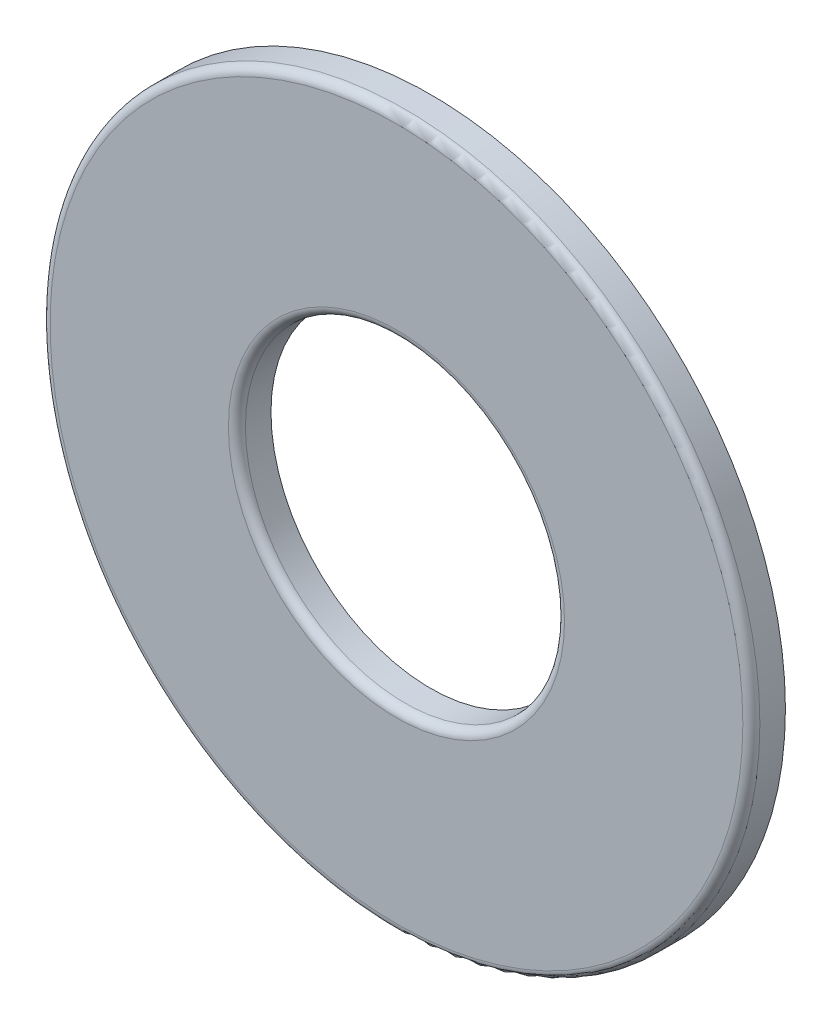
ISO-10303-21;
HEADER;
FILE_DESCRIPTION(('STEP AP214'),'2;1');
FILE_NAME('part.step','',(''),(''),'','','');
FILE_SCHEMA(('AUTOMOTIVE_DESIGN { 1 0 10303 214 1 1 1 1 }'));
ENDSEC;
DATA;
#1=APPLICATION_CONTEXT('core data for automotive mechanical design processes');
#2=APPLICATION_PROTOCOL_DEFINITION('international standard','automotive_design',2000,#1);
#3=PRODUCT_CONTEXT('',#1,'mechanical');
#4=PRODUCT('Part','Part','',(#3));
#5=PRODUCT_RELATED_PRODUCT_CATEGORY('part','',(#4));
#6=PRODUCT_DEFINITION_FORMATION('','',#4);
#7=PRODUCT_DEFINITION_CONTEXT('part definition',#1,'design');
#8=PRODUCT_DEFINITION('design','',#6,#7);
#9=PRODUCT_DEFINITION_SHAPE('','',#8);
#10=(LENGTH_UNIT() NAMED_UNIT(*) SI_UNIT(.MILLI.,.METRE.));
#11=(NAMED_UNIT(*) PLANE_ANGLE_UNIT() SI_UNIT($,.RADIAN.));
#12=(NAMED_UNIT(*) SI_UNIT($,.STERADIAN.) SOLID_ANGLE_UNIT());
#13=UNCERTAINTY_MEASURE_WITH_UNIT(LENGTH_MEASURE(1.E-05),#10,'distance_accuracy_value','');
#14=(GEOMETRIC_REPRESENTATION_CONTEXT(3) GLOBAL_UNCERTAINTY_ASSIGNED_CONTEXT((#13)) GLOBAL_UNIT_ASSIGNED_CONTEXT((#10,
#11,#12)) REPRESENTATION_CONTEXT('',''));
#15=CARTESIAN_POINT('',(0.,0.,0.));
#16=DIRECTION('',(0.,0.,1.));
#17=DIRECTION('',(1.,0.,0.));
#18=AXIS2_PLACEMENT_3D('',#15,#16,#17);
#19=CARTESIAN_POINT('',(0.,0.,0.381));
#20=DIRECTION('',(0.,0.,1.));
#21=DIRECTION('',(1.,0.,0.));
#22=AXIS2_PLACEMENT_3D('',#19,#20,#21);
#23=PLANE('',#22);
#24=CARTESIAN_POINT('',(0.,0.,0.381));
#25=DIRECTION('',(0.,0.,1.));
#26=DIRECTION('',(1.,0.,0.));
#27=AXIS2_PLACEMENT_3D('',#24,#25,#26);
#28=CIRCLE('',#27,7.747);
#29=CARTESIAN_POINT('',(7.747,0.,0.381));
#30=VERTEX_POINT('',#29);
#31=EDGE_CURVE('E53',#30,#30,#28,.T.);
#32=ORIENTED_EDGE('',*,*,#31,.T.);
#33=EDGE_LOOP('',(#32));
#34=FACE_BOUND('',#33,.T.);
#35=CARTESIAN_POINT('',(0.,0.,0.381));
#36=DIRECTION('',(0.,0.,1.));
#37=DIRECTION('',(1.,0.,0.));
#38=AXIS2_PLACEMENT_3D('',#35,#36,#37);
#39=CIRCLE('',#38,3.7592);
#40=CARTESIAN_POINT('',(3.7592,0.,0.381));
#41=VERTEX_POINT('',#40);
#42=EDGE_CURVE('E57',#41,#41,#39,.F.);
#43=ORIENTED_EDGE('',*,*,#42,.T.);
#44=EDGE_LOOP('',(#43));
#45=FACE_BOUND('',#44,.T.);
#46=ADVANCED_FACE('F42',(#34,#45),#23,.T.);
#47=CARTESIAN_POINT('',(0.,0.,0.381));
#48=DIRECTION('',(0.,0.,-1.));
#49=DIRECTION('',(-1.,0.,0.));
#50=AXIS2_PLACEMENT_3D('',#47,#48,#49);
#51=CYLINDRICAL_SURFACE('',#50,7.9375);
#52=CARTESIAN_POINT('',(0.,0.,0.1905));
#53=DIRECTION('',(0.,0.,1.));
#54=DIRECTION('',(1.,0.,0.));
#55=AXIS2_PLACEMENT_3D('',#52,#53,#54);
#56=CIRCLE('',#55,7.9375);
#57=CARTESIAN_POINT('',(-7.9375,0.,0.1905));
#58=VERTEX_POINT('',#57);
#59=EDGE_CURVE('E49',#58,#58,#56,.F.);
#60=CARTESIAN_POINT('',(0.,0.,-0.381));
#61=DIRECTION('',(0.,0.,1.));
#62=DIRECTION('',(1.,0.,0.));
#63=AXIS2_PLACEMENT_3D('',#60,#61,#62);
#64=CIRCLE('',#63,7.9375);
#65=CARTESIAN_POINT('',(-7.9375,0.,-0.381));
#66=VERTEX_POINT('',#65);
#67=EDGE_CURVE('E62',#66,#66,#64,.T.);
#68=CARTESIAN_POINT('',(-7.9375,0.,0.1905));
#69=CARTESIAN_POINT('',(-7.9375,0.,0.184546875));
#70=CARTESIAN_POINT('',(-7.9375,0.,0.17859375));
#71=CARTESIAN_POINT('',(-7.9375,0.,0.1666875));
#72=CARTESIAN_POINT('',(-7.9375,0.,0.160734375));
#73=CARTESIAN_POINT('',(-7.9375,0.,0.148828125));
#74=CARTESIAN_POINT('',(-7.9375,0.,0.142875));
#75=CARTESIAN_POINT('',(-7.9375,0.,0.13096875));
#76=CARTESIAN_POINT('',(-7.9375,0.,0.125015625));
#77=CARTESIAN_POINT('',(-7.9375,0.,0.113109375));
#78=CARTESIAN_POINT('',(-7.9375,0.,0.10715625));
#79=CARTESIAN_POINT('',(-7.9375,0.,0.09525));
#80=CARTESIAN_POINT('',(-7.9375,0.,0.089296875));
#81=CARTESIAN_POINT('',(-7.9375,0.,0.077390625));
#82=CARTESIAN_POINT('',(-7.9375,0.,0.0714375));
#83=CARTESIAN_POINT('',(-7.9375,0.,0.05953125));
#84=CARTESIAN_POINT('',(-7.9375,0.,0.053578125));
#85=CARTESIAN_POINT('',(-7.9375,0.,0.041671875));
#86=CARTESIAN_POINT('',(-7.9375,0.,0.03571875));
#87=CARTESIAN_POINT('',(-7.9375,0.,0.0238125));
#88=CARTESIAN_POINT('',(-7.9375,0.,0.017859375));
#89=CARTESIAN_POINT('',(-7.9375,0.,0.00595312499999999));
#90=CARTESIAN_POINT('',(-7.9375,0.,0.));
#91=CARTESIAN_POINT('',(-7.9375,0.,-0.01190625));
#92=CARTESIAN_POINT('',(-7.9375,0.,-0.017859375));
#93=CARTESIAN_POINT('',(-7.9375,0.,-0.029765625));
#94=CARTESIAN_POINT('',(-7.9375,0.,-0.03571875));
#95=CARTESIAN_POINT('',(-7.9375,0.,-0.047625));
#96=CARTESIAN_POINT('',(-7.9375,0.,-0.053578125));
#97=CARTESIAN_POINT('',(-7.9375,0.,-0.065484375));
#98=CARTESIAN_POINT('',(-7.9375,0.,-0.0714375));
#99=CARTESIAN_POINT('',(-7.9375,0.,-0.08334375));
#100=CARTESIAN_POINT('',(-7.9375,0.,-0.089296875));
#101=CARTESIAN_POINT('',(-7.9375,0.,-0.101203125));
#102=CARTESIAN_POINT('',(-7.9375,0.,-0.10715625));
#103=CARTESIAN_POINT('',(-7.9375,0.,-0.1190625));
#104=CARTESIAN_POINT('',(-7.9375,0.,-0.125015625));
#105=CARTESIAN_POINT('',(-7.9375,0.,-0.136921875));
#106=CARTESIAN_POINT('',(-7.9375,0.,-0.142875));
#107=CARTESIAN_POINT('',(-7.9375,0.,-0.15478125));
#108=CARTESIAN_POINT('',(-7.9375,0.,-0.160734375));
#109=CARTESIAN_POINT('',(-7.9375,0.,-0.172640625));
#110=CARTESIAN_POINT('',(-7.9375,0.,-0.17859375));
#111=CARTESIAN_POINT('',(-7.9375,0.,-0.1905));
#112=CARTESIAN_POINT('',(-7.9375,0.,-0.196453125));
#113=CARTESIAN_POINT('',(-7.9375,0.,-0.208359375));
#114=CARTESIAN_POINT('',(-7.9375,0.,-0.2143125));
#115=CARTESIAN_POINT('',(-7.9375,0.,-0.22621875));
#116=CARTESIAN_POINT('',(-7.9375,0.,-0.232171875));
#117=CARTESIAN_POINT('',(-7.9375,0.,-0.244078125));
#118=CARTESIAN_POINT('',(-7.9375,0.,-0.25003125));
#119=CARTESIAN_POINT('',(-7.9375,0.,-0.2619375));
#120=CARTESIAN_POINT('',(-7.9375,0.,-0.267890625));
#121=CARTESIAN_POINT('',(-7.9375,0.,-0.279796875));
#122=CARTESIAN_POINT('',(-7.9375,0.,-0.28575));
#123=CARTESIAN_POINT('',(-7.9375,0.,-0.29765625));
#124=CARTESIAN_POINT('',(-7.9375,0.,-0.303609375));
#125=CARTESIAN_POINT('',(-7.9375,0.,-0.315515625));
#126=CARTESIAN_POINT('',(-7.9375,0.,-0.32146875));
#127=CARTESIAN_POINT('',(-7.9375,0.,-0.333375));
#128=CARTESIAN_POINT('',(-7.9375,0.,-0.339328125));
#129=CARTESIAN_POINT('',(-7.9375,0.,-0.351234375));
#130=CARTESIAN_POINT('',(-7.9375,0.,-0.3571875));
#131=CARTESIAN_POINT('',(-7.9375,0.,-0.36909375));
#132=CARTESIAN_POINT('',(-7.9375,0.,-0.375046875));
#133=CARTESIAN_POINT('',(-7.9375,0.,-0.381));
#134=B_SPLINE_CURVE_WITH_KNOTS('',3,(#68,#69,#70,#71,#72,#73,#74,#75,#76,#77,#78,#79,#80,#81,
#82,#83,#84,#85,#86,#87,#88,#89,#90,#91,#92,#93,#94,#95,#96,#97,#98,#99,#100,#101,#102,#103,
#104,#105,#106,#107,#108,#109,#110,#111,#112,#113,#114,#115,#116,#117,#118,#119,#120,#121,#122,
#123,#124,#125,#126,#127,#128,#129,#130,#131,#132,#133),.UNSPECIFIED.,.F.,.F.,(4,2,2,2,2,2,2,2,
2,2,2,2,2,2,2,2,2,2,2,2,2,2,2,2,2,2,2,2,2,2,2,2,4),(0.,0.017859375,0.03571875,0.053578125,
0.0714375,0.089296875,0.10715625,0.125015625,0.142875,0.160734375,0.17859375,0.196453125,
0.2143125,0.232171875,0.25003125,0.267890625,0.28575,0.303609375,0.32146875,0.339328125,
0.3571875,0.375046875,0.39290625,0.410765625,0.428625,0.446484375,0.46434375,0.482203125,
0.5000625,0.517921875,0.53578125,0.553640625,0.5715),.UNSPECIFIED.);
#135=EDGE_CURVE('BSEAM74',#58,#66,#134,.T.);
#136=ORIENTED_EDGE('',*,*,#59,.T.);
#137=ORIENTED_EDGE('',*,*,#67,.T.);
#138=ORIENTED_EDGE('',*,*,#135,.T.);
#139=ORIENTED_EDGE('',*,*,#135,.F.);
#140=EDGE_LOOP('',(#136,#138,#137,#139));
#141=FACE_BOUND('',#140,.T.);
#142=ADVANCED_FACE('F74',(#141),#51,.T.);
#143=CARTESIAN_POINT('',(0.,0.,0.381));
#144=DIRECTION('',(0.,0.,-1.));
#145=DIRECTION('',(-1.,0.,0.));
#146=AXIS2_PLACEMENT_3D('',#143,#144,#145);
#147=CYLINDRICAL_SURFACE('',#146,3.5687);
#148=CARTESIAN_POINT('',(0.,0.,0.1905));
#149=DIRECTION('',(0.,0.,1.));
#150=DIRECTION('',(1.,0.,0.));
#151=AXIS2_PLACEMENT_3D('',#148,#149,#150);
#152=CIRCLE('',#151,3.5687);
#153=CARTESIAN_POINT('',(-3.5687,0.,0.1905));
#154=VERTEX_POINT('',#153);
#155=EDGE_CURVE('E10',#154,#154,#152,.T.);
#156=CARTESIAN_POINT('',(0.,0.,-0.381));
#157=DIRECTION('',(0.,0.,1.));
#158=DIRECTION('',(1.,0.,0.));
#159=AXIS2_PLACEMENT_3D('',#156,#157,#158);
#160=CIRCLE('',#159,3.5687);
#161=CARTESIAN_POINT('',(-3.5687,0.,-0.381));
#162=VERTEX_POINT('',#161);
#163=EDGE_CURVE('E65',#162,#162,#160,.T.);
#164=CARTESIAN_POINT('',(-3.5687,0.,0.1905));
#165=CARTESIAN_POINT('',(-3.5687,0.,0.184546875));
#166=CARTESIAN_POINT('',(-3.5687,0.,0.17859375));
#167=CARTESIAN_POINT('',(-3.5687,0.,0.1666875));
#168=CARTESIAN_POINT('',(-3.5687,0.,0.160734375));
#169=CARTESIAN_POINT('',(-3.5687,0.,0.148828125));
#170=CARTESIAN_POINT('',(-3.5687,0.,0.142875));
#171=CARTESIAN_POINT('',(-3.5687,0.,0.13096875));
#172=CARTESIAN_POINT('',(-3.5687,0.,0.125015625));
#173=CARTESIAN_POINT('',(-3.5687,0.,0.113109375));
#174=CARTESIAN_POINT('',(-3.5687,0.,0.10715625));
#175=CARTESIAN_POINT('',(-3.5687,0.,0.09525));
#176=CARTESIAN_POINT('',(-3.5687,0.,0.089296875));
#177=CARTESIAN_POINT('',(-3.5687,0.,0.077390625));
#178=CARTESIAN_POINT('',(-3.5687,0.,0.0714375));
#179=CARTESIAN_POINT('',(-3.5687,0.,0.05953125));
#180=CARTESIAN_POINT('',(-3.5687,0.,0.053578125));
#181=CARTESIAN_POINT('',(-3.5687,0.,0.041671875));
#182=CARTESIAN_POINT('',(-3.5687,0.,0.03571875));
#183=CARTESIAN_POINT('',(-3.5687,0.,0.0238125));
#184=CARTESIAN_POINT('',(-3.5687,0.,0.017859375));
#185=CARTESIAN_POINT('',(-3.5687,0.,0.00595312499999999));
#186=CARTESIAN_POINT('',(-3.5687,0.,0.));
#187=CARTESIAN_POINT('',(-3.5687,0.,-0.01190625));
#188=CARTESIAN_POINT('',(-3.5687,0.,-0.017859375));
#189=CARTESIAN_POINT('',(-3.5687,0.,-0.029765625));
#190=CARTESIAN_POINT('',(-3.5687,0.,-0.03571875));
#191=CARTESIAN_POINT('',(-3.5687,0.,-0.047625));
#192=CARTESIAN_POINT('',(-3.5687,0.,-0.053578125));
#193=CARTESIAN_POINT('',(-3.5687,0.,-0.065484375));
#194=CARTESIAN_POINT('',(-3.5687,0.,-0.0714375));
#195=CARTESIAN_POINT('',(-3.5687,0.,-0.08334375));
#196=CARTESIAN_POINT('',(-3.5687,0.,-0.089296875));
#197=CARTESIAN_POINT('',(-3.5687,0.,-0.101203125));
#198=CARTESIAN_POINT('',(-3.5687,0.,-0.10715625));
#199=CARTESIAN_POINT('',(-3.5687,0.,-0.1190625));
#200=CARTESIAN_POINT('',(-3.5687,0.,-0.125015625));
#201=CARTESIAN_POINT('',(-3.5687,0.,-0.136921875));
#202=CARTESIAN_POINT('',(-3.5687,0.,-0.142875));
#203=CARTESIAN_POINT('',(-3.5687,0.,-0.15478125));
#204=CARTESIAN_POINT('',(-3.5687,0.,-0.160734375));
#205=CARTESIAN_POINT('',(-3.5687,0.,-0.172640625));
#206=CARTESIAN_POINT('',(-3.5687,0.,-0.17859375));
#207=CARTESIAN_POINT('',(-3.5687,0.,-0.1905));
#208=CARTESIAN_POINT('',(-3.5687,0.,-0.196453125));
#209=CARTESIAN_POINT('',(-3.5687,0.,-0.208359375));
#210=CARTESIAN_POINT('',(-3.5687,0.,-0.2143125));
#211=CARTESIAN_POINT('',(-3.5687,0.,-0.22621875));
#212=CARTESIAN_POINT('',(-3.5687,0.,-0.232171875));
#213=CARTESIAN_POINT('',(-3.5687,0.,-0.244078125));
#214=CARTESIAN_POINT('',(-3.5687,0.,-0.25003125));
#215=CARTESIAN_POINT('',(-3.5687,0.,-0.2619375));
#216=CARTESIAN_POINT('',(-3.5687,0.,-0.267890625));
#217=CARTESIAN_POINT('',(-3.5687,0.,-0.279796875));
#218=CARTESIAN_POINT('',(-3.5687,0.,-0.28575));
#219=CARTESIAN_POINT('',(-3.5687,0.,-0.29765625));
#220=CARTESIAN_POINT('',(-3.5687,0.,-0.303609375));
#221=CARTESIAN_POINT('',(-3.5687,0.,-0.315515625));
#222=CARTESIAN_POINT('',(-3.5687,0.,-0.32146875));
#223=CARTESIAN_POINT('',(-3.5687,0.,-0.333375));
#224=CARTESIAN_POINT('',(-3.5687,0.,-0.339328125));
#225=CARTESIAN_POINT('',(-3.5687,0.,-0.351234375));
#226=CARTESIAN_POINT('',(-3.5687,0.,-0.3571875));
#227=CARTESIAN_POINT('',(-3.5687,0.,-0.36909375));
#228=CARTESIAN_POINT('',(-3.5687,0.,-0.375046875));
#229=CARTESIAN_POINT('',(-3.5687,0.,-0.381));
#230=B_SPLINE_CURVE_WITH_KNOTS('',3,(#164,#165,#166,#167,#168,#169,#170,#171,#172,#173,#174,
#175,#176,#177,#178,#179,#180,#181,#182,#183,#184,#185,#186,#187,#188,#189,#190,#191,#192,#193,
#194,#195,#196,#197,#198,#199,#200,#201,#202,#203,#204,#205,#206,#207,#208,#209,#210,#211,#212,
#213,#214,#215,#216,#217,#218,#219,#220,#221,#222,#223,#224,#225,#226,#227,#228,#229),
.UNSPECIFIED.,.F.,.F.,(4,2,2,2,2,2,2,2,2,2,2,2,2,2,2,2,2,2,2,2,2,2,2,2,2,2,2,2,2,2,2,2,4),(0.,
0.017859375,0.03571875,0.053578125,0.0714375,0.089296875,0.10715625,0.125015625,0.142875,
0.160734375,0.17859375,0.196453125,0.2143125,0.232171875,0.25003125,0.267890625,0.28575,
0.303609375,0.32146875,0.339328125,0.3571875,0.375046875,0.39290625,0.410765625,0.428625,
0.446484375,0.46434375,0.482203125,0.5000625,0.517921875,0.53578125,0.553640625,0.5715),.UNSPECIFIED.);
#231=EDGE_CURVE('BSEAM72',#154,#162,#230,.T.);
#232=ORIENTED_EDGE('',*,*,#155,.T.);
#233=ORIENTED_EDGE('',*,*,#163,.F.);
#234=ORIENTED_EDGE('',*,*,#231,.T.);
#235=ORIENTED_EDGE('',*,*,#231,.F.);
#236=EDGE_LOOP('',(#232,#234,#233,#235));
#237=FACE_BOUND('',#236,.T.);
#238=ADVANCED_FACE('F72',(#237),#147,.F.);
#239=CARTESIAN_POINT('',(0.,0.,-0.381));
#240=DIRECTION('',(0.,0.,1.));
#241=DIRECTION('',(1.,0.,0.));
#242=AXIS2_PLACEMENT_3D('',#239,#240,#241);
#243=PLANE('',#242);
#244=ORIENTED_EDGE('',*,*,#163,.T.);
#245=EDGE_LOOP('',(#244));
#246=FACE_BOUND('',#245,.T.);
#247=ORIENTED_EDGE('',*,*,#67,.F.);
#248=EDGE_LOOP('',(#247));
#249=FACE_BOUND('',#248,.T.);
#250=ADVANCED_FACE('F69',(#246,#249),#243,.F.);
#251=CARTESIAN_POINT('',(0.,0.,0.1905));
#252=DIRECTION('',(0.,0.,1.));
#253=DIRECTION('',(1.,0.,0.));
#254=AXIS2_PLACEMENT_3D('',#251,#252,#253);
#255=TOROIDAL_SURFACE('',#254,7.747,0.1905);
#256=ORIENTED_EDGE('',*,*,#59,.F.);
#257=EDGE_LOOP('',(#256));
#258=FACE_BOUND('',#257,.T.);
#259=ORIENTED_EDGE('',*,*,#31,.F.);
#260=EDGE_LOOP('',(#259));
#261=FACE_BOUND('',#260,.T.);
#262=ADVANCED_FACE('F81',(#258,#261),#255,.T.);
#263=CARTESIAN_POINT('',(0.,0.,0.1905));
#264=DIRECTION('',(0.,0.,1.));
#265=DIRECTION('',(1.,0.,0.));
#266=AXIS2_PLACEMENT_3D('',#263,#264,#265);
#267=TOROIDAL_SURFACE('',#266,3.7592,0.1905);
#268=ORIENTED_EDGE('',*,*,#42,.F.);
#269=EDGE_LOOP('',(#268));
#270=FACE_BOUND('',#269,.T.);
#271=ORIENTED_EDGE('',*,*,#155,.F.);
#272=EDGE_LOOP('',(#271));
#273=FACE_BOUND('',#272,.T.);
#274=ADVANCED_FACE('F44',(#270,#273),#267,.T.);
#275=CLOSED_SHELL('',(#46,#142,#238,#250,#262,#274));
#276=MANIFOLD_SOLID_BREP('B2',#275);
#277=ADVANCED_BREP_SHAPE_REPRESENTATION('',(#18,#276),#14);
#278=SHAPE_DEFINITION_REPRESENTATION(#9,#277);
ENDSEC;
END-ISO-10303-21;
